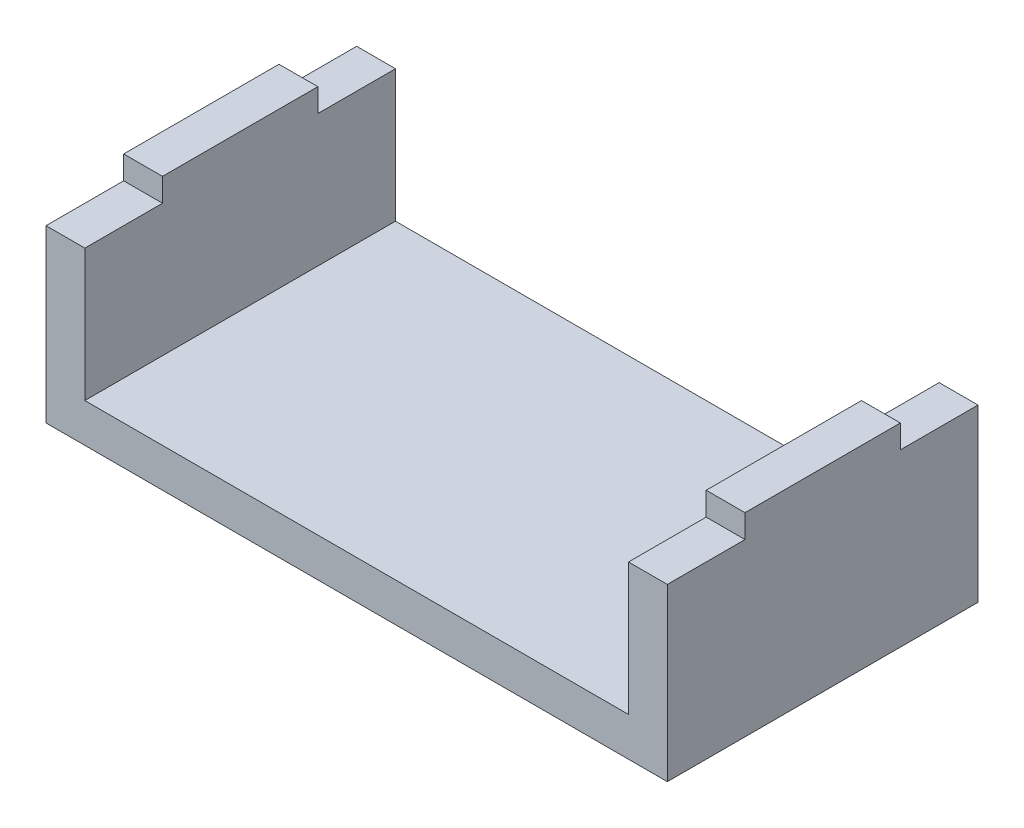
ISO-10303-21;
HEADER;
FILE_DESCRIPTION(('STEP AP214'),'2;1');
FILE_NAME('part.step','',(''),(''),'','','');
FILE_SCHEMA(('AUTOMOTIVE_DESIGN { 1 0 10303 214 1 1 1 1 }'));
ENDSEC;
DATA;
#1=APPLICATION_CONTEXT('core data for automotive mechanical design processes');
#2=APPLICATION_PROTOCOL_DEFINITION('international standard','automotive_design',2000,#1);
#3=PRODUCT_CONTEXT('',#1,'mechanical');
#4=PRODUCT('Part','Part','',(#3));
#5=PRODUCT_RELATED_PRODUCT_CATEGORY('part','',(#4));
#6=PRODUCT_DEFINITION_FORMATION('','',#4);
#7=PRODUCT_DEFINITION_CONTEXT('part definition',#1,'design');
#8=PRODUCT_DEFINITION('design','',#6,#7);
#9=PRODUCT_DEFINITION_SHAPE('','',#8);
#10=(LENGTH_UNIT() NAMED_UNIT(*) SI_UNIT(.MILLI.,.METRE.));
#11=(NAMED_UNIT(*) PLANE_ANGLE_UNIT() SI_UNIT($,.RADIAN.));
#12=(NAMED_UNIT(*) SI_UNIT($,.STERADIAN.) SOLID_ANGLE_UNIT());
#13=UNCERTAINTY_MEASURE_WITH_UNIT(LENGTH_MEASURE(1.E-05),#10,'distance_accuracy_value','');
#14=(GEOMETRIC_REPRESENTATION_CONTEXT(3) GLOBAL_UNCERTAINTY_ASSIGNED_CONTEXT((#13)) GLOBAL_UNIT_ASSIGNED_CONTEXT((#10,
#11,#12)) REPRESENTATION_CONTEXT('',''));
#15=CARTESIAN_POINT('',(0.,0.,0.));
#16=DIRECTION('',(0.,0.,1.));
#17=DIRECTION('',(1.,0.,0.));
#18=AXIS2_PLACEMENT_3D('',#15,#16,#17);
#19=CARTESIAN_POINT('',(-40.,5.,20.));
#20=DIRECTION('',(0.,0.,-1.));
#21=DIRECTION('',(-1.,0.,0.));
#22=AXIS2_PLACEMENT_3D('',#19,#20,#21);
#23=PLANE('',#22);
#24=DIRECTION('',(1.,0.,0.));
#25=VECTOR('',#24,1.);
#26=CARTESIAN_POINT('',(40.,22.,20.));
#27=LINE('',#26,#25);
#28=CARTESIAN_POINT('',(35.,22.,20.));
#29=VERTEX_POINT('',#28);
#30=CARTESIAN_POINT('',(40.,22.,20.));
#31=VERTEX_POINT('',#30);
#32=EDGE_CURVE('E217',#29,#31,#27,.T.);
#33=ORIENTED_EDGE('',*,*,#32,.F.);
#34=DIRECTION('',(0.,-1.,0.));
#35=VECTOR('',#34,1.);
#36=CARTESIAN_POINT('',(35.,25.,20.));
#37=LINE('',#36,#35);
#38=CARTESIAN_POINT('',(35.,5.,20.));
#39=VERTEX_POINT('',#38);
#40=EDGE_CURVE('E305',#29,#39,#37,.T.);
#41=ORIENTED_EDGE('',*,*,#40,.T.);
#42=DIRECTION('',(1.,0.,0.));
#43=VECTOR('',#42,1.);
#44=CARTESIAN_POINT('',(-40.,5.,20.));
#45=LINE('',#44,#43);
#46=CARTESIAN_POINT('',(-35.,5.,20.));
#47=VERTEX_POINT('',#46);
#48=EDGE_CURVE('E333',#47,#39,#45,.T.);
#49=ORIENTED_EDGE('',*,*,#48,.F.);
#50=DIRECTION('',(0.,-1.,0.));
#51=VECTOR('',#50,1.);
#52=CARTESIAN_POINT('',(-35.,25.,20.));
#53=LINE('',#52,#51);
#54=CARTESIAN_POINT('',(-35.,22.,20.));
#55=VERTEX_POINT('',#54);
#56=EDGE_CURVE('E329',#55,#47,#53,.T.);
#57=ORIENTED_EDGE('',*,*,#56,.F.);
#58=DIRECTION('',(1.,0.,0.));
#59=VECTOR('',#58,1.);
#60=CARTESIAN_POINT('',(-40.,22.,20.));
#61=LINE('',#60,#59);
#62=CARTESIAN_POINT('',(-40.,22.,20.));
#63=VERTEX_POINT('',#62);
#64=EDGE_CURVE('E279',#63,#55,#61,.T.);
#65=ORIENTED_EDGE('',*,*,#64,.F.);
#66=DIRECTION('',(0.,-1.,0.));
#67=VECTOR('',#66,1.);
#68=CARTESIAN_POINT('',(-40.,5.,20.));
#69=LINE('',#68,#67);
#70=CARTESIAN_POINT('',(-40.,0.,20.));
#71=VERTEX_POINT('',#70);
#72=EDGE_CURVE('E11',#63,#71,#69,.T.);
#73=ORIENTED_EDGE('',*,*,#72,.T.);
#74=DIRECTION('',(1.,0.,0.));
#75=VECTOR('',#74,1.);
#76=CARTESIAN_POINT('',(-40.,0.,20.));
#77=LINE('',#76,#75);
#78=CARTESIAN_POINT('',(40.,0.,20.));
#79=VERTEX_POINT('',#78);
#80=EDGE_CURVE('E346',#71,#79,#77,.T.);
#81=ORIENTED_EDGE('',*,*,#80,.T.);
#82=DIRECTION('',(0.,-1.,0.));
#83=VECTOR('',#82,1.);
#84=CARTESIAN_POINT('',(40.,5.,20.));
#85=LINE('',#84,#83);
#86=EDGE_CURVE('E48',#31,#79,#85,.T.);
#87=ORIENTED_EDGE('',*,*,#86,.F.);
#88=EDGE_LOOP('',(#33,#41,#49,#57,#65,#73,#81,#87));
#89=FACE_BOUND('',#88,.T.);
#90=ADVANCED_FACE('F39',(#89),#23,.F.);
#91=CARTESIAN_POINT('',(-40.,5.,-20.));
#92=DIRECTION('',(0.,0.,1.));
#93=DIRECTION('',(1.,0.,0.));
#94=AXIS2_PLACEMENT_3D('',#91,#92,#93);
#95=PLANE('',#94);
#96=DIRECTION('',(-1.,0.,0.));
#97=VECTOR('',#96,1.);
#98=CARTESIAN_POINT('',(40.,22.,-20.));
#99=LINE('',#98,#97);
#100=CARTESIAN_POINT('',(40.,22.,-20.));
#101=VERTEX_POINT('',#100);
#102=CARTESIAN_POINT('',(35.,22.,-20.));
#103=VERTEX_POINT('',#102);
#104=EDGE_CURVE('E233',#101,#103,#99,.T.);
#105=ORIENTED_EDGE('',*,*,#104,.F.);
#106=DIRECTION('',(0.,-1.,0.));
#107=VECTOR('',#106,1.);
#108=CARTESIAN_POINT('',(40.,5.,-20.));
#109=LINE('',#108,#107);
#110=CARTESIAN_POINT('',(40.,0.,-20.));
#111=VERTEX_POINT('',#110);
#112=EDGE_CURVE('E359',#101,#111,#109,.T.);
#113=ORIENTED_EDGE('',*,*,#112,.T.);
#114=DIRECTION('',(-1.,0.,0.));
#115=VECTOR('',#114,1.);
#116=CARTESIAN_POINT('',(-40.,0.,-20.));
#117=LINE('',#116,#115);
#118=CARTESIAN_POINT('',(-40.,0.,-20.));
#119=VERTEX_POINT('',#118);
#120=EDGE_CURVE('E338',#111,#119,#117,.T.);
#121=ORIENTED_EDGE('',*,*,#120,.T.);
#122=DIRECTION('',(0.,-1.,0.));
#123=VECTOR('',#122,1.);
#124=CARTESIAN_POINT('',(-40.,5.,-20.));
#125=LINE('',#124,#123);
#126=CARTESIAN_POINT('',(-40.,22.,-20.));
#127=VERTEX_POINT('',#126);
#128=EDGE_CURVE('E342',#127,#119,#125,.T.);
#129=ORIENTED_EDGE('',*,*,#128,.F.);
#130=DIRECTION('',(-1.,0.,0.));
#131=VECTOR('',#130,1.);
#132=CARTESIAN_POINT('',(-40.,22.,-20.));
#133=LINE('',#132,#131);
#134=CARTESIAN_POINT('',(-35.,22.,-20.));
#135=VERTEX_POINT('',#134);
#136=EDGE_CURVE('E262',#135,#127,#133,.T.);
#137=ORIENTED_EDGE('',*,*,#136,.F.);
#138=DIRECTION('',(0.,-1.,0.));
#139=VECTOR('',#138,1.);
#140=CARTESIAN_POINT('',(-35.,25.,-20.));
#141=LINE('',#140,#139);
#142=CARTESIAN_POINT('',(-35.,5.,-20.));
#143=VERTEX_POINT('',#142);
#144=EDGE_CURVE('E323',#135,#143,#141,.T.);
#145=ORIENTED_EDGE('',*,*,#144,.T.);
#146=DIRECTION('',(-1.,0.,0.));
#147=VECTOR('',#146,1.);
#148=CARTESIAN_POINT('',(-40.,5.,-20.));
#149=LINE('',#148,#147);
#150=CARTESIAN_POINT('',(35.,5.,-20.));
#151=VERTEX_POINT('',#150);
#152=EDGE_CURVE('E337',#151,#143,#149,.T.);
#153=ORIENTED_EDGE('',*,*,#152,.F.);
#154=DIRECTION('',(0.,-1.,0.));
#155=VECTOR('',#154,1.);
#156=CARTESIAN_POINT('',(35.,25.,-20.));
#157=LINE('',#156,#155);
#158=EDGE_CURVE('E311',#103,#151,#157,.T.);
#159=ORIENTED_EDGE('',*,*,#158,.F.);
#160=EDGE_LOOP('',(#105,#113,#121,#129,#137,#145,#153,#159));
#161=FACE_BOUND('',#160,.T.);
#162=ADVANCED_FACE('F381',(#161),#95,.F.);
#163=CARTESIAN_POINT('',(0.,5.,0.));
#164=DIRECTION('',(0.,1.,0.));
#165=DIRECTION('',(0.,0.,1.));
#166=AXIS2_PLACEMENT_3D('',#163,#164,#165);
#167=PLANE('',#166);
#168=ORIENTED_EDGE('',*,*,#48,.T.);
#169=DIRECTION('',(0.,0.,1.));
#170=VECTOR('',#169,1.);
#171=CARTESIAN_POINT('',(35.,5.,-20.));
#172=LINE('',#171,#170);
#173=EDGE_CURVE('E273',#151,#39,#172,.T.);
#174=ORIENTED_EDGE('',*,*,#173,.F.);
#175=ORIENTED_EDGE('',*,*,#152,.T.);
#176=DIRECTION('',(0.,0.,-1.));
#177=VECTOR('',#176,1.);
#178=CARTESIAN_POINT('',(-35.,5.,-20.));
#179=LINE('',#178,#177);
#180=EDGE_CURVE('E314',#47,#143,#179,.T.);
#181=ORIENTED_EDGE('',*,*,#180,.F.);
#182=EDGE_LOOP('',(#168,#174,#175,#181));
#183=FACE_BOUND('',#182,.T.);
#184=ADVANCED_FACE('F404',(#183),#167,.T.);
#185=CARTESIAN_POINT('',(-40.,5.,-20.));
#186=DIRECTION('',(1.,0.,0.));
#187=DIRECTION('',(0.,0.,-1.));
#188=AXIS2_PLACEMENT_3D('',#185,#186,#187);
#189=PLANE('',#188);
#190=DIRECTION('',(0.,0.,1.));
#191=VECTOR('',#190,1.);
#192=CARTESIAN_POINT('',(-40.,25.,-20.));
#193=LINE('',#192,#191);
#194=CARTESIAN_POINT('',(-40.,25.,-10.));
#195=VERTEX_POINT('',#194);
#196=CARTESIAN_POINT('',(-40.,25.,10.));
#197=VERTEX_POINT('',#196);
#198=EDGE_CURVE('E315',#195,#197,#193,.T.);
#199=ORIENTED_EDGE('',*,*,#198,.F.);
#200=DIRECTION('',(0.,1.,0.));
#201=VECTOR('',#200,1.);
#202=CARTESIAN_POINT('',(-40.,22.,-10.));
#203=LINE('',#202,#201);
#204=CARTESIAN_POINT('',(-40.,22.,-10.));
#205=VERTEX_POINT('',#204);
#206=EDGE_CURVE('E265',#205,#195,#203,.T.);
#207=ORIENTED_EDGE('',*,*,#206,.F.);
#208=DIRECTION('',(0.,0.,1.));
#209=VECTOR('',#208,1.);
#210=CARTESIAN_POINT('',(-40.,22.,-20.));
#211=LINE('',#210,#209);
#212=EDGE_CURVE('E250',#127,#205,#211,.T.);
#213=ORIENTED_EDGE('',*,*,#212,.F.);
#214=ORIENTED_EDGE('',*,*,#128,.T.);
#215=DIRECTION('',(0.,0.,1.));
#216=VECTOR('',#215,1.);
#217=CARTESIAN_POINT('',(-40.,0.,-20.));
#218=LINE('',#217,#216);
#219=EDGE_CURVE('E332',#119,#71,#218,.T.);
#220=ORIENTED_EDGE('',*,*,#219,.T.);
#221=ORIENTED_EDGE('',*,*,#72,.F.);
#222=DIRECTION('',(0.,0.,1.));
#223=VECTOR('',#222,1.);
#224=CARTESIAN_POINT('',(-40.,22.,10.));
#225=LINE('',#224,#223);
#226=CARTESIAN_POINT('',(-40.,22.,10.));
#227=VERTEX_POINT('',#226);
#228=EDGE_CURVE('E276',#227,#63,#225,.T.);
#229=ORIENTED_EDGE('',*,*,#228,.F.);
#230=DIRECTION('',(0.,1.,0.));
#231=VECTOR('',#230,1.);
#232=CARTESIAN_POINT('',(-40.,22.,10.));
#233=LINE('',#232,#231);
#234=EDGE_CURVE('E268',#227,#197,#233,.T.);
#235=ORIENTED_EDGE('',*,*,#234,.T.);
#236=EDGE_LOOP('',(#199,#207,#213,#214,#220,#221,#229,#235));
#237=FACE_BOUND('',#236,.T.);
#238=ADVANCED_FACE('F41',(#237),#189,.F.);
#239=CARTESIAN_POINT('',(40.,5.,-20.));
#240=DIRECTION('',(-1.,0.,0.));
#241=DIRECTION('',(0.,0.,1.));
#242=AXIS2_PLACEMENT_3D('',#239,#240,#241);
#243=PLANE('',#242);
#244=DIRECTION('',(0.,0.,-1.));
#245=VECTOR('',#244,1.);
#246=CARTESIAN_POINT('',(40.,25.,-20.));
#247=LINE('',#246,#245);
#248=CARTESIAN_POINT('',(40.,25.,10.));
#249=VERTEX_POINT('',#248);
#250=CARTESIAN_POINT('',(40.,25.,-10.));
#251=VERTEX_POINT('',#250);
#252=EDGE_CURVE('E297',#249,#251,#247,.T.);
#253=ORIENTED_EDGE('',*,*,#252,.F.);
#254=DIRECTION('',(0.,1.,0.));
#255=VECTOR('',#254,1.);
#256=CARTESIAN_POINT('',(40.,22.,10.));
#257=LINE('',#256,#255);
#258=CARTESIAN_POINT('',(40.,22.,10.));
#259=VERTEX_POINT('',#258);
#260=EDGE_CURVE('E63',#259,#249,#257,.T.);
#261=ORIENTED_EDGE('',*,*,#260,.F.);
#262=DIRECTION('',(0.,0.,-1.));
#263=VECTOR('',#262,1.);
#264=CARTESIAN_POINT('',(40.,22.,20.));
#265=LINE('',#264,#263);
#266=EDGE_CURVE('E205',#31,#259,#265,.T.);
#267=ORIENTED_EDGE('',*,*,#266,.F.);
#268=ORIENTED_EDGE('',*,*,#86,.T.);
#269=DIRECTION('',(0.,0.,-1.));
#270=VECTOR('',#269,1.);
#271=CARTESIAN_POINT('',(40.,0.,-20.));
#272=LINE('',#271,#270);
#273=EDGE_CURVE('E350',#79,#111,#272,.T.);
#274=ORIENTED_EDGE('',*,*,#273,.T.);
#275=ORIENTED_EDGE('',*,*,#112,.F.);
#276=DIRECTION('',(0.,0.,-1.));
#277=VECTOR('',#276,1.);
#278=CARTESIAN_POINT('',(40.,22.,-10.));
#279=LINE('',#278,#277);
#280=CARTESIAN_POINT('',(40.,22.,-10.));
#281=VERTEX_POINT('',#280);
#282=EDGE_CURVE('E230',#281,#101,#279,.T.);
#283=ORIENTED_EDGE('',*,*,#282,.F.);
#284=DIRECTION('',(0.,1.,0.));
#285=VECTOR('',#284,1.);
#286=CARTESIAN_POINT('',(40.,22.,-10.));
#287=LINE('',#286,#285);
#288=EDGE_CURVE('E222',#281,#251,#287,.T.);
#289=ORIENTED_EDGE('',*,*,#288,.T.);
#290=EDGE_LOOP('',(#253,#261,#267,#268,#274,#275,#283,#289));
#291=FACE_BOUND('',#290,.T.);
#292=ADVANCED_FACE('F366',(#291),#243,.F.);
#293=CARTESIAN_POINT('',(0.,0.,0.));
#294=DIRECTION('',(0.,1.,0.));
#295=DIRECTION('',(0.,0.,1.));
#296=AXIS2_PLACEMENT_3D('',#293,#294,#295);
#297=PLANE('',#296);
#298=CARTESIAN_POINT('',(-37.5,0.,17.5));
#299=DIRECTION('',(0.,-1.,0.));
#300=DIRECTION('',(0.,0.,-1.));
#301=AXIS2_PLACEMENT_3D('',#298,#299,#300);
#302=CIRCLE('',#301,1.69999999999999);
#303=CARTESIAN_POINT('',(-37.5,0.,15.8));
#304=VERTEX_POINT('',#303);
#305=EDGE_CURVE('E175',#304,#304,#302,.T.);
#306=ORIENTED_EDGE('',*,*,#305,.F.);
#307=EDGE_LOOP('',(#306));
#308=FACE_BOUND('',#307,.T.);
#309=CARTESIAN_POINT('',(-37.5,0.,-17.5));
#310=DIRECTION('',(0.,-1.,0.));
#311=DIRECTION('',(0.,0.,-1.));
#312=AXIS2_PLACEMENT_3D('',#309,#310,#311);
#313=CIRCLE('',#312,1.69999999999999);
#314=CARTESIAN_POINT('',(-37.5,0.,-19.2));
#315=VERTEX_POINT('',#314);
#316=EDGE_CURVE('E174',#315,#315,#313,.T.);
#317=ORIENTED_EDGE('',*,*,#316,.F.);
#318=EDGE_LOOP('',(#317));
#319=FACE_BOUND('',#318,.T.);
#320=CARTESIAN_POINT('',(37.5,0.,-17.5));
#321=DIRECTION('',(0.,-1.,0.));
#322=DIRECTION('',(0.,0.,-1.));
#323=AXIS2_PLACEMENT_3D('',#320,#321,#322);
#324=CIRCLE('',#323,1.69999999999999);
#325=CARTESIAN_POINT('',(37.5,0.,-19.2));
#326=VERTEX_POINT('',#325);
#327=EDGE_CURVE('E188',#326,#326,#324,.T.);
#328=ORIENTED_EDGE('',*,*,#327,.F.);
#329=EDGE_LOOP('',(#328));
#330=FACE_BOUND('',#329,.T.);
#331=CARTESIAN_POINT('',(37.5,0.,17.5));
#332=DIRECTION('',(0.,-1.,0.));
#333=DIRECTION('',(0.,0.,-1.));
#334=AXIS2_PLACEMENT_3D('',#331,#332,#333);
#335=CIRCLE('',#334,1.69999999999999);
#336=CARTESIAN_POINT('',(37.5,0.,15.8));
#337=VERTEX_POINT('',#336);
#338=EDGE_CURVE('E196',#337,#337,#335,.T.);
#339=ORIENTED_EDGE('',*,*,#338,.F.);
#340=EDGE_LOOP('',(#339));
#341=FACE_BOUND('',#340,.T.);
#342=ORIENTED_EDGE('',*,*,#219,.F.);
#343=ORIENTED_EDGE('',*,*,#120,.F.);
#344=ORIENTED_EDGE('',*,*,#273,.F.);
#345=ORIENTED_EDGE('',*,*,#80,.F.);
#346=EDGE_LOOP('',(#342,#343,#344,#345));
#347=FACE_BOUND('',#346,.T.);
#348=ADVANCED_FACE('F377',(#308,#319,#330,#341,#347),#297,.F.);
#349=CARTESIAN_POINT('',(-35.,25.,-20.));
#350=DIRECTION('',(-1.,0.,0.));
#351=DIRECTION('',(0.,0.,1.));
#352=AXIS2_PLACEMENT_3D('',#349,#350,#351);
#353=PLANE('',#352);
#354=DIRECTION('',(0.,0.,-1.));
#355=VECTOR('',#354,1.);
#356=CARTESIAN_POINT('',(-35.,22.,-20.));
#357=LINE('',#356,#355);
#358=CARTESIAN_POINT('',(-35.,22.,-10.));
#359=VERTEX_POINT('',#358);
#360=EDGE_CURVE('E259',#359,#135,#357,.T.);
#361=ORIENTED_EDGE('',*,*,#360,.F.);
#362=DIRECTION('',(0.,1.,0.));
#363=VECTOR('',#362,1.);
#364=CARTESIAN_POINT('',(-35.,22.,-10.));
#365=LINE('',#364,#363);
#366=CARTESIAN_POINT('',(-35.,25.,-10.));
#367=VERTEX_POINT('',#366);
#368=EDGE_CURVE('E269',#359,#367,#365,.T.);
#369=ORIENTED_EDGE('',*,*,#368,.T.);
#370=DIRECTION('',(0.,0.,-1.));
#371=VECTOR('',#370,1.);
#372=CARTESIAN_POINT('',(-35.,25.,-20.));
#373=LINE('',#372,#371);
#374=CARTESIAN_POINT('',(-35.,25.,10.));
#375=VERTEX_POINT('',#374);
#376=EDGE_CURVE('E319',#375,#367,#373,.T.);
#377=ORIENTED_EDGE('',*,*,#376,.F.);
#378=DIRECTION('',(0.,1.,0.));
#379=VECTOR('',#378,1.);
#380=CARTESIAN_POINT('',(-35.,22.,10.));
#381=LINE('',#380,#379);
#382=CARTESIAN_POINT('',(-35.,22.,10.));
#383=VERTEX_POINT('',#382);
#384=EDGE_CURVE('E289',#383,#375,#381,.T.);
#385=ORIENTED_EDGE('',*,*,#384,.F.);
#386=DIRECTION('',(0.,0.,-1.));
#387=VECTOR('',#386,1.);
#388=CARTESIAN_POINT('',(-35.,22.,10.));
#389=LINE('',#388,#387);
#390=EDGE_CURVE('E282',#55,#383,#389,.T.);
#391=ORIENTED_EDGE('',*,*,#390,.F.);
#392=ORIENTED_EDGE('',*,*,#56,.T.);
#393=ORIENTED_EDGE('',*,*,#180,.T.);
#394=ORIENTED_EDGE('',*,*,#144,.F.);
#395=EDGE_LOOP('',(#361,#369,#377,#385,#391,#392,#393,#394));
#396=FACE_BOUND('',#395,.T.);
#397=ADVANCED_FACE('F409',(#396),#353,.F.);
#398=CARTESIAN_POINT('',(0.,25.,0.));
#399=DIRECTION('',(0.,1.,0.));
#400=DIRECTION('',(0.,0.,1.));
#401=AXIS2_PLACEMENT_3D('',#398,#399,#400);
#402=PLANE('',#401);
#403=DIRECTION('',(1.,0.,0.));
#404=VECTOR('',#403,1.);
#405=CARTESIAN_POINT('',(-40.,25.,-10.));
#406=LINE('',#405,#404);
#407=EDGE_CURVE('E255',#195,#367,#406,.T.);
#408=ORIENTED_EDGE('',*,*,#407,.F.);
#409=ORIENTED_EDGE('',*,*,#198,.T.);
#410=DIRECTION('',(-1.,0.,0.));
#411=VECTOR('',#410,1.);
#412=CARTESIAN_POINT('',(-40.,25.,10.));
#413=LINE('',#412,#411);
#414=EDGE_CURVE('E227',#375,#197,#413,.T.);
#415=ORIENTED_EDGE('',*,*,#414,.F.);
#416=ORIENTED_EDGE('',*,*,#376,.T.);
#417=EDGE_LOOP('',(#408,#409,#415,#416));
#418=FACE_BOUND('',#417,.T.);
#419=ADVANCED_FACE('F425',(#418),#402,.T.);
#420=CARTESIAN_POINT('',(35.,25.,-20.));
#421=DIRECTION('',(1.,0.,0.));
#422=DIRECTION('',(0.,0.,-1.));
#423=AXIS2_PLACEMENT_3D('',#420,#421,#422);
#424=PLANE('',#423);
#425=DIRECTION('',(0.,0.,1.));
#426=VECTOR('',#425,1.);
#427=CARTESIAN_POINT('',(35.,22.,20.));
#428=LINE('',#427,#426);
#429=CARTESIAN_POINT('',(35.,22.,10.));
#430=VERTEX_POINT('',#429);
#431=EDGE_CURVE('E214',#430,#29,#428,.T.);
#432=ORIENTED_EDGE('',*,*,#431,.F.);
#433=DIRECTION('',(0.,1.,0.));
#434=VECTOR('',#433,1.);
#435=CARTESIAN_POINT('',(35.,22.,10.));
#436=LINE('',#435,#434);
#437=CARTESIAN_POINT('',(35.,25.,10.));
#438=VERTEX_POINT('',#437);
#439=EDGE_CURVE('E223',#430,#438,#436,.T.);
#440=ORIENTED_EDGE('',*,*,#439,.T.);
#441=DIRECTION('',(0.,0.,1.));
#442=VECTOR('',#441,1.);
#443=CARTESIAN_POINT('',(35.,25.,-20.));
#444=LINE('',#443,#442);
#445=CARTESIAN_POINT('',(35.,25.,-10.));
#446=VERTEX_POINT('',#445);
#447=EDGE_CURVE('E301',#446,#438,#444,.T.);
#448=ORIENTED_EDGE('',*,*,#447,.F.);
#449=DIRECTION('',(0.,1.,0.));
#450=VECTOR('',#449,1.);
#451=CARTESIAN_POINT('',(35.,22.,-10.));
#452=LINE('',#451,#450);
#453=CARTESIAN_POINT('',(35.,22.,-10.));
#454=VERTEX_POINT('',#453);
#455=EDGE_CURVE('E55',#454,#446,#452,.T.);
#456=ORIENTED_EDGE('',*,*,#455,.F.);
#457=DIRECTION('',(0.,0.,1.));
#458=VECTOR('',#457,1.);
#459=CARTESIAN_POINT('',(35.,22.,-10.));
#460=LINE('',#459,#458);
#461=EDGE_CURVE('E236',#103,#454,#460,.T.);
#462=ORIENTED_EDGE('',*,*,#461,.F.);
#463=ORIENTED_EDGE('',*,*,#158,.T.);
#464=ORIENTED_EDGE('',*,*,#173,.T.);
#465=ORIENTED_EDGE('',*,*,#40,.F.);
#466=EDGE_LOOP('',(#432,#440,#448,#456,#462,#463,#464,#465));
#467=FACE_BOUND('',#466,.T.);
#468=ADVANCED_FACE('F392',(#467),#424,.F.);
#469=CARTESIAN_POINT('',(0.,25.,0.));
#470=DIRECTION('',(0.,-1.,0.));
#471=DIRECTION('',(0.,0.,-1.));
#472=AXIS2_PLACEMENT_3D('',#469,#470,#471);
#473=PLANE('',#472);
#474=ORIENTED_EDGE('',*,*,#447,.T.);
#475=DIRECTION('',(-1.,0.,0.));
#476=VECTOR('',#475,1.);
#477=CARTESIAN_POINT('',(40.,25.,10.));
#478=LINE('',#477,#476);
#479=EDGE_CURVE('E210',#249,#438,#478,.T.);
#480=ORIENTED_EDGE('',*,*,#479,.F.);
#481=ORIENTED_EDGE('',*,*,#252,.T.);
#482=DIRECTION('',(1.,0.,0.));
#483=VECTOR('',#482,1.);
#484=CARTESIAN_POINT('',(40.,25.,-10.));
#485=LINE('',#484,#483);
#486=EDGE_CURVE('E204',#446,#251,#485,.T.);
#487=ORIENTED_EDGE('',*,*,#486,.F.);
#488=EDGE_LOOP('',(#474,#480,#481,#487));
#489=FACE_BOUND('',#488,.T.);
#490=ADVANCED_FACE('F394',(#489),#473,.F.);
#491=CARTESIAN_POINT('',(-40.,22.,10.));
#492=DIRECTION('',(0.,0.,-1.));
#493=DIRECTION('',(-1.,0.,0.));
#494=AXIS2_PLACEMENT_3D('',#491,#492,#493);
#495=PLANE('',#494);
#496=ORIENTED_EDGE('',*,*,#414,.T.);
#497=ORIENTED_EDGE('',*,*,#234,.F.);
#498=DIRECTION('',(-1.,0.,0.));
#499=VECTOR('',#498,1.);
#500=CARTESIAN_POINT('',(-40.,22.,10.));
#501=LINE('',#500,#499);
#502=EDGE_CURVE('E285',#383,#227,#501,.T.);
#503=ORIENTED_EDGE('',*,*,#502,.F.);
#504=ORIENTED_EDGE('',*,*,#384,.T.);
#505=EDGE_LOOP('',(#496,#497,#503,#504));
#506=FACE_BOUND('',#505,.T.);
#507=ADVANCED_FACE('F427',(#506),#495,.F.);
#508=CARTESIAN_POINT('',(0.,22.,0.));
#509=DIRECTION('',(0.,1.,0.));
#510=DIRECTION('',(0.,0.,1.));
#511=AXIS2_PLACEMENT_3D('',#508,#509,#510);
#512=PLANE('',#511);
#513=ORIENTED_EDGE('',*,*,#228,.T.);
#514=ORIENTED_EDGE('',*,*,#64,.T.);
#515=ORIENTED_EDGE('',*,*,#390,.T.);
#516=ORIENTED_EDGE('',*,*,#502,.T.);
#517=EDGE_LOOP('',(#513,#514,#515,#516));
#518=FACE_BOUND('',#517,.T.);
#519=ADVANCED_FACE('F429',(#518),#512,.T.);
#520=CARTESIAN_POINT('',(-40.,22.,-10.));
#521=DIRECTION('',(0.,0.,1.));
#522=DIRECTION('',(1.,0.,0.));
#523=AXIS2_PLACEMENT_3D('',#520,#521,#522);
#524=PLANE('',#523);
#525=ORIENTED_EDGE('',*,*,#407,.T.);
#526=ORIENTED_EDGE('',*,*,#368,.F.);
#527=DIRECTION('',(1.,0.,0.));
#528=VECTOR('',#527,1.);
#529=CARTESIAN_POINT('',(-40.,22.,-10.));
#530=LINE('',#529,#528);
#531=EDGE_CURVE('E254',#205,#359,#530,.T.);
#532=ORIENTED_EDGE('',*,*,#531,.F.);
#533=ORIENTED_EDGE('',*,*,#206,.T.);
#534=EDGE_LOOP('',(#525,#526,#532,#533));
#535=FACE_BOUND('',#534,.T.);
#536=ADVANCED_FACE('F431',(#535),#524,.F.);
#537=CARTESIAN_POINT('',(0.,22.,0.));
#538=DIRECTION('',(0.,1.,0.));
#539=DIRECTION('',(0.,0.,1.));
#540=AXIS2_PLACEMENT_3D('',#537,#538,#539);
#541=PLANE('',#540);
#542=ORIENTED_EDGE('',*,*,#212,.T.);
#543=ORIENTED_EDGE('',*,*,#531,.T.);
#544=ORIENTED_EDGE('',*,*,#360,.T.);
#545=ORIENTED_EDGE('',*,*,#136,.T.);
#546=EDGE_LOOP('',(#542,#543,#544,#545));
#547=FACE_BOUND('',#546,.T.);
#548=ADVANCED_FACE('F419',(#547),#541,.T.);
#549=CARTESIAN_POINT('',(40.,22.,-10.));
#550=DIRECTION('',(0.,0.,1.));
#551=DIRECTION('',(1.,0.,0.));
#552=AXIS2_PLACEMENT_3D('',#549,#550,#551);
#553=PLANE('',#552);
#554=ORIENTED_EDGE('',*,*,#486,.T.);
#555=ORIENTED_EDGE('',*,*,#288,.F.);
#556=DIRECTION('',(1.,0.,0.));
#557=VECTOR('',#556,1.);
#558=CARTESIAN_POINT('',(40.,22.,-10.));
#559=LINE('',#558,#557);
#560=EDGE_CURVE('E239',#454,#281,#559,.T.);
#561=ORIENTED_EDGE('',*,*,#560,.F.);
#562=ORIENTED_EDGE('',*,*,#455,.T.);
#563=EDGE_LOOP('',(#554,#555,#561,#562));
#564=FACE_BOUND('',#563,.T.);
#565=ADVANCED_FACE('F388',(#564),#553,.F.);
#566=CARTESIAN_POINT('',(0.,22.,0.));
#567=DIRECTION('',(0.,1.,0.));
#568=DIRECTION('',(0.,0.,1.));
#569=AXIS2_PLACEMENT_3D('',#566,#567,#568);
#570=PLANE('',#569);
#571=ORIENTED_EDGE('',*,*,#282,.T.);
#572=ORIENTED_EDGE('',*,*,#104,.T.);
#573=ORIENTED_EDGE('',*,*,#461,.T.);
#574=ORIENTED_EDGE('',*,*,#560,.T.);
#575=EDGE_LOOP('',(#571,#572,#573,#574));
#576=FACE_BOUND('',#575,.T.);
#577=ADVANCED_FACE('F386',(#576),#570,.T.);
#578=CARTESIAN_POINT('',(40.,22.,10.));
#579=DIRECTION('',(0.,0.,-1.));
#580=DIRECTION('',(-1.,0.,0.));
#581=AXIS2_PLACEMENT_3D('',#578,#579,#580);
#582=PLANE('',#581);
#583=ORIENTED_EDGE('',*,*,#479,.T.);
#584=ORIENTED_EDGE('',*,*,#439,.F.);
#585=DIRECTION('',(-1.,0.,0.));
#586=VECTOR('',#585,1.);
#587=CARTESIAN_POINT('',(40.,22.,10.));
#588=LINE('',#587,#586);
#589=EDGE_CURVE('E209',#259,#430,#588,.T.);
#590=ORIENTED_EDGE('',*,*,#589,.F.);
#591=ORIENTED_EDGE('',*,*,#260,.T.);
#592=EDGE_LOOP('',(#583,#584,#590,#591));
#593=FACE_BOUND('',#592,.T.);
#594=ADVANCED_FACE('F395',(#593),#582,.F.);
#595=CARTESIAN_POINT('',(0.,22.,0.));
#596=DIRECTION('',(0.,1.,0.));
#597=DIRECTION('',(0.,0.,1.));
#598=AXIS2_PLACEMENT_3D('',#595,#596,#597);
#599=PLANE('',#598);
#600=ORIENTED_EDGE('',*,*,#266,.T.);
#601=ORIENTED_EDGE('',*,*,#589,.T.);
#602=ORIENTED_EDGE('',*,*,#431,.T.);
#603=ORIENTED_EDGE('',*,*,#32,.T.);
#604=EDGE_LOOP('',(#600,#601,#602,#603));
#605=FACE_BOUND('',#604,.T.);
#606=ADVANCED_FACE('F397',(#605),#599,.T.);
#607=CARTESIAN_POINT('',(37.5,5.,17.5));
#608=DIRECTION('',(0.,-1.,0.));
#609=DIRECTION('',(0.,0.,-1.));
#610=AXIS2_PLACEMENT_3D('',#607,#608,#609);
#611=CONICAL_SURFACE('',#610,1.69999999999999,1.02974425867665);
#612=CARTESIAN_POINT('',(37.5,6.02146305234685,17.5));
#613=VERTEX_POINT('',#612);
#614=VERTEX_LOOP('',#613);
#615=FACE_BOUND('',#614,.T.);
#616=CARTESIAN_POINT('',(37.5,5.,17.5));
#617=DIRECTION('',(0.,-1.,0.));
#618=DIRECTION('',(0.,0.,-1.));
#619=AXIS2_PLACEMENT_3D('',#616,#617,#618);
#620=CIRCLE('',#619,1.69999999999999);
#621=CARTESIAN_POINT('',(37.5,5.,15.8));
#622=VERTEX_POINT('',#621);
#623=EDGE_CURVE('E200',#622,#622,#620,.T.);
#624=ORIENTED_EDGE('',*,*,#623,.T.);
#625=EDGE_LOOP('',(#624));
#626=FACE_BOUND('',#625,.T.);
#627=ADVANCED_FACE('F561',(#615,#626),#611,.F.);
#628=CARTESIAN_POINT('',(37.5,0.,17.5));
#629=DIRECTION('',(0.,-1.,0.));
#630=DIRECTION('',(0.,0.,-1.));
#631=AXIS2_PLACEMENT_3D('',#628,#629,#630);
#632=CYLINDRICAL_SURFACE('',#631,1.69999999999999);
#633=ORIENTED_EDGE('',*,*,#623,.F.);
#634=EDGE_LOOP('',(#633));
#635=FACE_BOUND('',#634,.T.);
#636=ORIENTED_EDGE('',*,*,#338,.T.);
#637=EDGE_LOOP('',(#636));
#638=FACE_BOUND('',#637,.T.);
#639=ADVANCED_FACE('F566',(#635,#638),#632,.F.);
#640=CARTESIAN_POINT('',(37.5,5.,-17.5));
#641=DIRECTION('',(0.,-1.,0.));
#642=DIRECTION('',(0.,0.,-1.));
#643=AXIS2_PLACEMENT_3D('',#640,#641,#642);
#644=CONICAL_SURFACE('',#643,1.69999999999999,1.02974425867665);
#645=CARTESIAN_POINT('',(37.5,6.02146305234685,-17.5));
#646=VERTEX_POINT('',#645);
#647=VERTEX_LOOP('',#646);
#648=FACE_BOUND('',#647,.T.);
#649=CARTESIAN_POINT('',(37.5,5.,-17.5));
#650=DIRECTION('',(0.,-1.,0.));
#651=DIRECTION('',(0.,0.,-1.));
#652=AXIS2_PLACEMENT_3D('',#649,#650,#651);
#653=CIRCLE('',#652,1.69999999999999);
#654=CARTESIAN_POINT('',(37.5,5.,-19.2));
#655=VERTEX_POINT('',#654);
#656=EDGE_CURVE('E192',#655,#655,#653,.T.);
#657=ORIENTED_EDGE('',*,*,#656,.T.);
#658=EDGE_LOOP('',(#657));
#659=FACE_BOUND('',#658,.T.);
#660=ADVANCED_FACE('F576',(#648,#659),#644,.F.);
#661=CARTESIAN_POINT('',(37.5,0.,-17.5));
#662=DIRECTION('',(0.,-1.,0.));
#663=DIRECTION('',(0.,0.,-1.));
#664=AXIS2_PLACEMENT_3D('',#661,#662,#663);
#665=CYLINDRICAL_SURFACE('',#664,1.69999999999999);
#666=ORIENTED_EDGE('',*,*,#656,.F.);
#667=EDGE_LOOP('',(#666));
#668=FACE_BOUND('',#667,.T.);
#669=ORIENTED_EDGE('',*,*,#327,.T.);
#670=EDGE_LOOP('',(#669));
#671=FACE_BOUND('',#670,.T.);
#672=ADVANCED_FACE('F586',(#668,#671),#665,.F.);
#673=CARTESIAN_POINT('',(-37.5,5.,-17.5));
#674=DIRECTION('',(0.,-1.,0.));
#675=DIRECTION('',(0.,0.,-1.));
#676=AXIS2_PLACEMENT_3D('',#673,#674,#675);
#677=CONICAL_SURFACE('',#676,1.69999999999999,1.02974425867665);
#678=CARTESIAN_POINT('',(-37.5,6.02146305234685,-17.5));
#679=VERTEX_POINT('',#678);
#680=VERTEX_LOOP('',#679);
#681=FACE_BOUND('',#680,.T.);
#682=CARTESIAN_POINT('',(-37.5,5.,-17.5));
#683=DIRECTION('',(0.,-1.,0.));
#684=DIRECTION('',(0.,0.,-1.));
#685=AXIS2_PLACEMENT_3D('',#682,#683,#684);
#686=CIRCLE('',#685,1.69999999999999);
#687=CARTESIAN_POINT('',(-37.5,5.,-19.2));
#688=VERTEX_POINT('',#687);
#689=EDGE_CURVE('E180',#688,#688,#686,.T.);
#690=ORIENTED_EDGE('',*,*,#689,.T.);
#691=EDGE_LOOP('',(#690));
#692=FACE_BOUND('',#691,.T.);
#693=ADVANCED_FACE('F596',(#681,#692),#677,.F.);
#694=CARTESIAN_POINT('',(-37.5,0.,-17.5));
#695=DIRECTION('',(0.,-1.,0.));
#696=DIRECTION('',(0.,0.,-1.));
#697=AXIS2_PLACEMENT_3D('',#694,#695,#696);
#698=CYLINDRICAL_SURFACE('',#697,1.69999999999999);
#699=ORIENTED_EDGE('',*,*,#689,.F.);
#700=EDGE_LOOP('',(#699));
#701=FACE_BOUND('',#700,.T.);
#702=ORIENTED_EDGE('',*,*,#316,.T.);
#703=EDGE_LOOP('',(#702));
#704=FACE_BOUND('',#703,.T.);
#705=ADVANCED_FACE('F167',(#701,#704),#698,.F.);
#706=CARTESIAN_POINT('',(-37.5,5.,17.5));
#707=DIRECTION('',(0.,-1.,0.));
#708=DIRECTION('',(0.,0.,-1.));
#709=AXIS2_PLACEMENT_3D('',#706,#707,#708);
#710=CONICAL_SURFACE('',#709,1.69999999999999,1.02974425867665);
#711=CARTESIAN_POINT('',(-37.5,6.02146305234685,17.5));
#712=VERTEX_POINT('',#711);
#713=VERTEX_LOOP('',#712);
#714=FACE_BOUND('',#713,.T.);
#715=CARTESIAN_POINT('',(-37.5,5.,17.5));
#716=DIRECTION('',(0.,-1.,0.));
#717=DIRECTION('',(0.,0.,-1.));
#718=AXIS2_PLACEMENT_3D('',#715,#716,#717);
#719=CIRCLE('',#718,1.69999999999999);
#720=CARTESIAN_POINT('',(-37.5,5.,15.8));
#721=VERTEX_POINT('',#720);
#722=EDGE_CURVE('E171',#721,#721,#719,.T.);
#723=ORIENTED_EDGE('',*,*,#722,.T.);
#724=EDGE_LOOP('',(#723));
#725=FACE_BOUND('',#724,.T.);
#726=ADVANCED_FACE('F163',(#714,#725),#710,.F.);
#727=CARTESIAN_POINT('',(-37.5,0.,17.5));
#728=DIRECTION('',(0.,-1.,0.));
#729=DIRECTION('',(0.,0.,-1.));
#730=AXIS2_PLACEMENT_3D('',#727,#728,#729);
#731=CYLINDRICAL_SURFACE('',#730,1.69999999999999);
#732=ORIENTED_EDGE('',*,*,#722,.F.);
#733=EDGE_LOOP('',(#732));
#734=FACE_BOUND('',#733,.T.);
#735=ORIENTED_EDGE('',*,*,#305,.T.);
#736=EDGE_LOOP('',(#735));
#737=FACE_BOUND('',#736,.T.);
#738=ADVANCED_FACE('F166',(#734,#737),#731,.F.);
#739=CLOSED_SHELL('',(#90,#162,#184,#238,#292,#348,#397,#419,#468,#490,#507,#519,#536,#548,#565,
#577,#594,#606,#627,#639,#660,#672,#693,#705,#726,#738));
#740=MANIFOLD_SOLID_BREP('B2',#739);
#741=ADVANCED_BREP_SHAPE_REPRESENTATION('',(#18,#740),#14);
#742=SHAPE_DEFINITION_REPRESENTATION(#9,#741);
ENDSEC;
END-ISO-10303-21;
